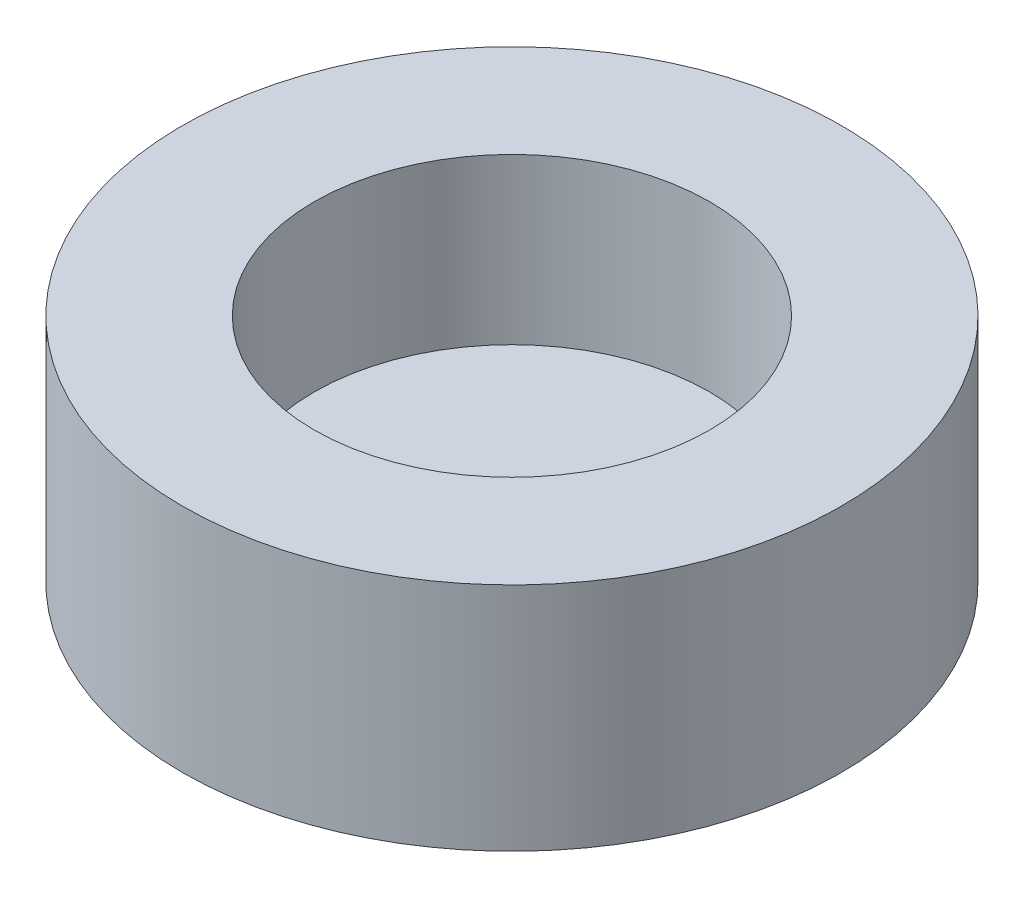
ISO-10303-21;
HEADER;
FILE_DESCRIPTION(('STEP AP214'),'2;1');
FILE_NAME('part.step','',(''),(''),'','','');
FILE_SCHEMA(('AUTOMOTIVE_DESIGN { 1 0 10303 214 1 1 1 1 }'));
ENDSEC;
DATA;
#1=APPLICATION_CONTEXT('core data for automotive mechanical design processes');
#2=APPLICATION_PROTOCOL_DEFINITION('international standard','automotive_design',2000,#1);
#3=PRODUCT_CONTEXT('',#1,'mechanical');
#4=PRODUCT('Part','Part','',(#3));
#5=PRODUCT_RELATED_PRODUCT_CATEGORY('part','',(#4));
#6=PRODUCT_DEFINITION_FORMATION('','',#4);
#7=PRODUCT_DEFINITION_CONTEXT('part definition',#1,'design');
#8=PRODUCT_DEFINITION('design','',#6,#7);
#9=PRODUCT_DEFINITION_SHAPE('','',#8);
#10=(LENGTH_UNIT() NAMED_UNIT(*) SI_UNIT(.MILLI.,.METRE.));
#11=(NAMED_UNIT(*) PLANE_ANGLE_UNIT() SI_UNIT($,.RADIAN.));
#12=(NAMED_UNIT(*) SI_UNIT($,.STERADIAN.) SOLID_ANGLE_UNIT());
#13=UNCERTAINTY_MEASURE_WITH_UNIT(LENGTH_MEASURE(1.E-05),#10,'distance_accuracy_value','');
#14=(GEOMETRIC_REPRESENTATION_CONTEXT(3) GLOBAL_UNCERTAINTY_ASSIGNED_CONTEXT((#13)) GLOBAL_UNIT_ASSIGNED_CONTEXT((#10,
#11,#12)) REPRESENTATION_CONTEXT('',''));
#15=CARTESIAN_POINT('',(0.,0.,0.));
#16=DIRECTION('',(0.,0.,1.));
#17=DIRECTION('',(1.,0.,0.));
#18=AXIS2_PLACEMENT_3D('',#15,#16,#17);
#19=CARTESIAN_POINT('',(0.,7.,0.));
#20=DIRECTION('',(0.,-1.,0.));
#21=DIRECTION('',(0.,0.,-1.));
#22=AXIS2_PLACEMENT_3D('',#19,#20,#21);
#23=CYLINDRICAL_SURFACE('',#22,10.);
#24=CARTESIAN_POINT('',(0.,7.,0.));
#25=DIRECTION('',(0.,1.,0.));
#26=DIRECTION('',(0.,0.,1.));
#27=AXIS2_PLACEMENT_3D('',#24,#25,#26);
#28=CIRCLE('',#27,10.);
#29=CARTESIAN_POINT('',(0.,7.,10.));
#30=VERTEX_POINT('',#29);
#31=EDGE_CURVE('E10',#30,#30,#28,.T.);
#32=ORIENTED_EDGE('',*,*,#31,.F.);
#33=EDGE_LOOP('',(#32));
#34=FACE_BOUND('',#33,.T.);
#35=CARTESIAN_POINT('',(0.,0.,0.));
#36=DIRECTION('',(0.,1.,0.));
#37=DIRECTION('',(0.,0.,1.));
#38=AXIS2_PLACEMENT_3D('',#35,#36,#37);
#39=CIRCLE('',#38,10.);
#40=CARTESIAN_POINT('',(0.,0.,10.));
#41=VERTEX_POINT('',#40);
#42=EDGE_CURVE('E34',#41,#41,#39,.T.);
#43=ORIENTED_EDGE('',*,*,#42,.T.);
#44=EDGE_LOOP('',(#43));
#45=FACE_BOUND('',#44,.T.);
#46=ADVANCED_FACE('F31',(#34,#45),#23,.T.);
#47=CARTESIAN_POINT('',(0.,7.,0.));
#48=DIRECTION('',(0.,1.,0.));
#49=DIRECTION('',(0.,0.,1.));
#50=AXIS2_PLACEMENT_3D('',#47,#48,#49);
#51=PLANE('',#50);
#52=CARTESIAN_POINT('',(0.,7.,0.));
#53=DIRECTION('',(0.,1.,0.));
#54=DIRECTION('',(0.,0.,1.));
#55=AXIS2_PLACEMENT_3D('',#52,#53,#54);
#56=CIRCLE('',#55,6.);
#57=CARTESIAN_POINT('',(0.,7.,6.));
#58=VERTEX_POINT('',#57);
#59=EDGE_CURVE('E43',#58,#58,#56,.T.);
#60=ORIENTED_EDGE('',*,*,#59,.F.);
#61=EDGE_LOOP('',(#60));
#62=FACE_BOUND('',#61,.T.);
#63=ORIENTED_EDGE('',*,*,#31,.T.);
#64=EDGE_LOOP('',(#63));
#65=FACE_BOUND('',#64,.T.);
#66=ADVANCED_FACE('F58',(#62,#65),#51,.T.);
#67=CARTESIAN_POINT('',(0.,0.,0.));
#68=DIRECTION('',(0.,1.,0.));
#69=DIRECTION('',(0.,0.,1.));
#70=AXIS2_PLACEMENT_3D('',#67,#68,#69);
#71=PLANE('',#70);
#72=ORIENTED_EDGE('',*,*,#42,.F.);
#73=EDGE_LOOP('',(#72));
#74=FACE_BOUND('',#73,.T.);
#75=ADVANCED_FACE('F54',(#74),#71,.F.);
#76=CARTESIAN_POINT('',(0.,2.,0.));
#77=DIRECTION('',(0.,1.,0.));
#78=DIRECTION('',(0.,0.,1.));
#79=AXIS2_PLACEMENT_3D('',#76,#77,#78);
#80=CYLINDRICAL_SURFACE('',#79,6.);
#81=CARTESIAN_POINT('',(0.,2.,0.));
#82=DIRECTION('',(0.,1.,0.));
#83=DIRECTION('',(0.,0.,1.));
#84=AXIS2_PLACEMENT_3D('',#81,#82,#83);
#85=CIRCLE('',#84,6.);
#86=CARTESIAN_POINT('',(0.,2.,6.));
#87=VERTEX_POINT('',#86);
#88=EDGE_CURVE('E41',#87,#87,#85,.T.);
#89=ORIENTED_EDGE('',*,*,#88,.F.);
#90=EDGE_LOOP('',(#89));
#91=FACE_BOUND('',#90,.T.);
#92=ORIENTED_EDGE('',*,*,#59,.T.);
#93=EDGE_LOOP('',(#92));
#94=FACE_BOUND('',#93,.T.);
#95=ADVANCED_FACE('F51',(#91,#94),#80,.F.);
#96=CARTESIAN_POINT('',(0.,2.,0.));
#97=DIRECTION('',(0.,1.,0.));
#98=DIRECTION('',(0.,0.,1.));
#99=AXIS2_PLACEMENT_3D('',#96,#97,#98);
#100=PLANE('',#99);
#101=ORIENTED_EDGE('',*,*,#88,.T.);
#102=EDGE_LOOP('',(#101));
#103=FACE_BOUND('',#102,.T.);
#104=ADVANCED_FACE('F49',(#103),#100,.T.);
#105=CLOSED_SHELL('',(#46,#66,#75,#95,#104));
#106=MANIFOLD_SOLID_BREP('B2',#105);
#107=ADVANCED_BREP_SHAPE_REPRESENTATION('',(#18,#106),#14);
#108=SHAPE_DEFINITION_REPRESENTATION(#9,#107);
ENDSEC;
END-ISO-10303-21;
